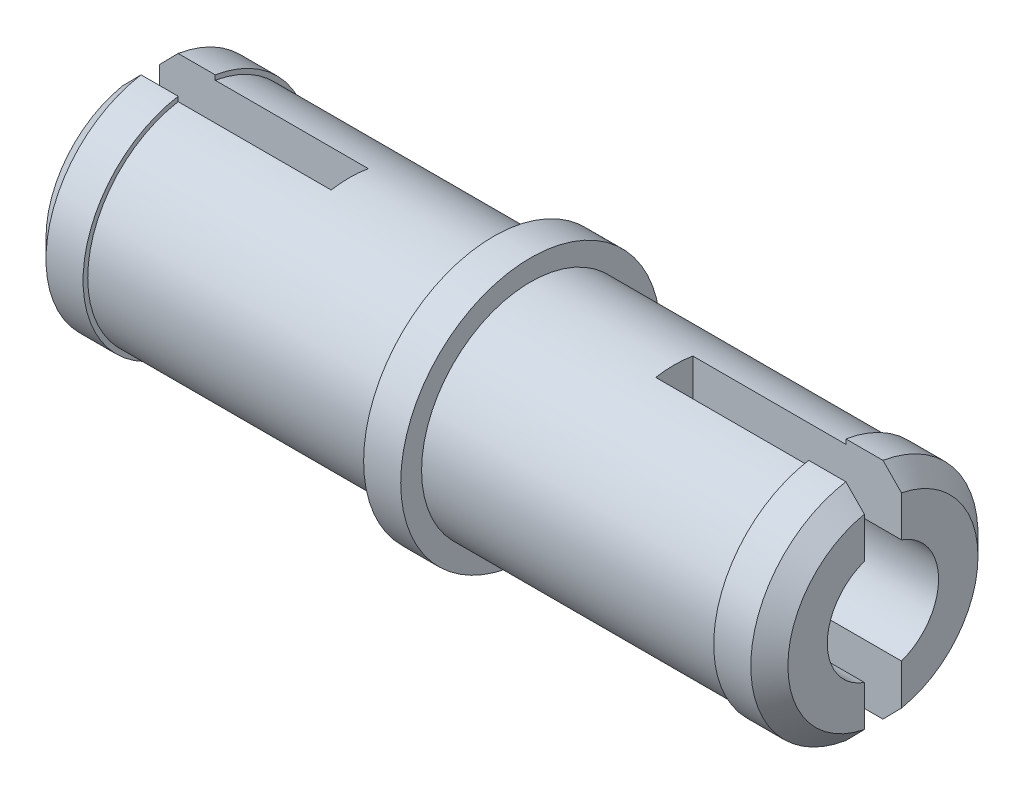
ISO-10303-21;
HEADER;
FILE_DESCRIPTION(('STEP AP214'),'2;1');
FILE_NAME('part.step','',(''),(''),'','','');
FILE_SCHEMA(('AUTOMOTIVE_DESIGN { 1 0 10303 214 1 1 1 1 }'));
ENDSEC;
DATA;
#1=APPLICATION_CONTEXT('core data for automotive mechanical design processes');
#2=APPLICATION_PROTOCOL_DEFINITION('international standard','automotive_design',2000,#1);
#3=PRODUCT_CONTEXT('',#1,'mechanical');
#4=PRODUCT('Part','Part','',(#3));
#5=PRODUCT_RELATED_PRODUCT_CATEGORY('part','',(#4));
#6=PRODUCT_DEFINITION_FORMATION('','',#4);
#7=PRODUCT_DEFINITION_CONTEXT('part definition',#1,'design');
#8=PRODUCT_DEFINITION('design','',#6,#7);
#9=PRODUCT_DEFINITION_SHAPE('','',#8);
#10=(LENGTH_UNIT() NAMED_UNIT(*) SI_UNIT(.MILLI.,.METRE.));
#11=(NAMED_UNIT(*) PLANE_ANGLE_UNIT() SI_UNIT($,.RADIAN.));
#12=(NAMED_UNIT(*) SI_UNIT($,.STERADIAN.) SOLID_ANGLE_UNIT());
#13=UNCERTAINTY_MEASURE_WITH_UNIT(LENGTH_MEASURE(1.E-05),#10,'distance_accuracy_value','');
#14=(GEOMETRIC_REPRESENTATION_CONTEXT(3) GLOBAL_UNCERTAINTY_ASSIGNED_CONTEXT((#13)) GLOBAL_UNIT_ASSIGNED_CONTEXT((#10,
#11,#12)) REPRESENTATION_CONTEXT('',''));
#15=CARTESIAN_POINT('',(0.,0.,0.));
#16=DIRECTION('',(0.,0.,1.));
#17=DIRECTION('',(1.,0.,0.));
#18=AXIS2_PLACEMENT_3D('',#15,#16,#17);
#19=CARTESIAN_POINT('',(3.5,-2.8,-0.400000000000001));
#20=DIRECTION('',(-1.,0.,0.));
#21=DIRECTION('',(0.,0.,1.));
#22=AXIS2_PLACEMENT_3D('',#19,#20,#21);
#23=PLANE('',#22);
#24=DIRECTION('',(0.,1.,0.));
#25=VECTOR('',#24,1.);
#26=CARTESIAN_POINT('',(3.5,-2.8,0.399999999999999));
#27=LINE('',#26,#25);
#28=CARTESIAN_POINT('',(3.5,1.13137084989848,0.399999999999999));
#29=VERTEX_POINT('',#28);
#30=CARTESIAN_POINT('',(3.5,2.31570723538188,0.399999999999999));
#31=VERTEX_POINT('',#30);
#32=EDGE_CURVE('E445',#29,#31,#27,.T.);
#33=ORIENTED_EDGE('',*,*,#32,.F.);
#34=CARTESIAN_POINT('',(3.5,0.,0.));
#35=DIRECTION('',(-1.,0.,0.));
#36=DIRECTION('',(0.,0.,1.));
#37=AXIS2_PLACEMENT_3D('',#34,#35,#36);
#38=CIRCLE('',#37,1.2);
#39=CARTESIAN_POINT('',(3.5,1.13137084989848,-0.400000000000001));
#40=VERTEX_POINT('',#39);
#41=EDGE_CURVE('E60',#29,#40,#38,.T.);
#42=ORIENTED_EDGE('',*,*,#41,.T.);
#43=DIRECTION('',(0.,1.,0.));
#44=VECTOR('',#43,1.);
#45=CARTESIAN_POINT('',(3.5,-2.8,-0.400000000000001));
#46=LINE('',#45,#44);
#47=CARTESIAN_POINT('',(3.5,2.31570723538188,-0.400000000000001));
#48=VERTEX_POINT('',#47);
#49=EDGE_CURVE('E436',#40,#48,#46,.T.);
#50=ORIENTED_EDGE('',*,*,#49,.T.);
#51=CARTESIAN_POINT('',(3.5,0.,0.));
#52=DIRECTION('',(-1.,0.,0.));
#53=DIRECTION('',(0.,0.,1.));
#54=AXIS2_PLACEMENT_3D('',#51,#52,#53);
#55=CIRCLE('',#54,2.35);
#56=EDGE_CURVE('E312',#31,#48,#55,.T.);
#57=ORIENTED_EDGE('',*,*,#56,.F.);
#58=EDGE_LOOP('',(#33,#42,#50,#57));
#59=FACE_BOUND('',#58,.T.);
#60=ADVANCED_FACE('F43',(#59),#23,.F.);
#61=CARTESIAN_POINT('',(9.51719509390282,-2.8,-0.400000000000001));
#62=DIRECTION('',(0.,0.,-1.));
#63=DIRECTION('',(-1.,0.,0.));
#64=AXIS2_PLACEMENT_3D('',#61,#62,#63);
#65=PLANE('',#64);
#66=ORIENTED_EDGE('',*,*,#49,.F.);
#67=DIRECTION('',(1.,0.,0.));
#68=VECTOR('',#67,1.);
#69=CARTESIAN_POINT('',(-8.,1.13137084989848,-0.4));
#70=LINE('',#69,#68);
#71=CARTESIAN_POINT('',(8.,1.13137084989848,-0.4));
#72=VERTEX_POINT('',#71);
#73=EDGE_CURVE('E427',#40,#72,#70,.T.);
#74=ORIENTED_EDGE('',*,*,#73,.T.);
#75=DIRECTION('',(0.,-1.,0.));
#76=VECTOR('',#75,1.);
#77=CARTESIAN_POINT('',(8.,2.45,-0.400000000000001));
#78=LINE('',#77,#76);
#79=CARTESIAN_POINT('',(8.,2.01059692628831,-0.400000000000001));
#80=VERTEX_POINT('',#79);
#81=EDGE_CURVE('E470',#80,#72,#78,.T.);
#82=ORIENTED_EDGE('',*,*,#81,.F.);
#83=CARTESIAN_POINT('',(8.,2.01059692628831,-0.400000000000001));
#84=CARTESIAN_POINT('',(7.93343243156125,2.07844935031966,-0.400000000000001));
#85=CARTESIAN_POINT('',(7.86681531242129,2.14625301950762,-0.400000000000001));
#86=CARTESIAN_POINT('',(7.73348197907854,2.2817628417537,-0.400000000000001));
#87=CARTESIAN_POINT('',(7.66676576488516,2.34946899482109,-0.400000000000001));
#88=CARTESIAN_POINT('',(7.6,2.41712639305437,-0.400000000000001));
#89=B_SPLINE_CURVE_WITH_KNOTS('',3,(#83,#84,#85,#86,#87,#88),.UNSPECIFIED.,.F.,.F.,(4,2,4),(0.,
0.285160661839464,0.57032129656195),.UNSPECIFIED.);
#90=CARTESIAN_POINT('',(7.6,2.41712639305437,-0.4));
#91=VERTEX_POINT('',#90);
#92=EDGE_CURVE('E519',#80,#91,#89,.T.);
#93=ORIENTED_EDGE('',*,*,#92,.T.);
#94=DIRECTION('',(-1.,0.,0.));
#95=VECTOR('',#94,1.);
#96=CARTESIAN_POINT('',(-8.,2.41712639305437,-0.4));
#97=LINE('',#96,#95);
#98=CARTESIAN_POINT('',(6.8,2.41712639305437,-0.4));
#99=VERTEX_POINT('',#98);
#100=EDGE_CURVE('E304',#99,#91,#97,.F.);
#101=ORIENTED_EDGE('',*,*,#100,.F.);
#102=DIRECTION('',(0.,1.,0.));
#103=VECTOR('',#102,1.);
#104=CARTESIAN_POINT('',(6.8,2.35,-0.400000000000001));
#105=LINE('',#104,#103);
#106=CARTESIAN_POINT('',(6.8,2.31570723538188,-0.400000000000001));
#107=VERTEX_POINT('',#106);
#108=EDGE_CURVE('E462',#107,#99,#105,.T.);
#109=ORIENTED_EDGE('',*,*,#108,.F.);
#110=DIRECTION('',(-1.,0.,0.));
#111=VECTOR('',#110,1.);
#112=CARTESIAN_POINT('',(-8.,2.31570723538188,-0.4));
#113=LINE('',#112,#111);
#114=EDGE_CURVE('E465',#48,#107,#113,.F.);
#115=ORIENTED_EDGE('',*,*,#114,.F.);
#116=EDGE_LOOP('',(#66,#74,#82,#93,#101,#109,#115));
#117=FACE_BOUND('',#116,.T.);
#118=ADVANCED_FACE('F563',(#117),#65,.F.);
#119=CARTESIAN_POINT('',(9.51719509390282,-2.8,0.399999999999999));
#120=DIRECTION('',(0.,0.,1.));
#121=DIRECTION('',(1.,0.,0.));
#122=AXIS2_PLACEMENT_3D('',#119,#120,#121);
#123=PLANE('',#122);
#124=CARTESIAN_POINT('',(3.5,-2.31570723538188,0.399999999999999));
#125=VERTEX_POINT('',#124);
#126=CARTESIAN_POINT('',(3.5,-1.13137084989848,0.4));
#127=VERTEX_POINT('',#126);
#128=EDGE_CURVE('E442',#125,#127,#27,.T.);
#129=ORIENTED_EDGE('',*,*,#128,.T.);
#130=DIRECTION('',(1.,0.,0.));
#131=VECTOR('',#130,1.);
#132=CARTESIAN_POINT('',(-8.,-1.13137084989848,0.4));
#133=LINE('',#132,#131);
#134=CARTESIAN_POINT('',(8.,-1.13137084989848,0.399999999999999));
#135=VERTEX_POINT('',#134);
#136=EDGE_CURVE('E424',#127,#135,#133,.T.);
#137=ORIENTED_EDGE('',*,*,#136,.T.);
#138=DIRECTION('',(0.,1.,0.));
#139=VECTOR('',#138,1.);
#140=CARTESIAN_POINT('',(8.,2.45,0.399999999999999));
#141=LINE('',#140,#139);
#142=CARTESIAN_POINT('',(8.,-2.01059692628831,0.399999999999999));
#143=VERTEX_POINT('',#142);
#144=EDGE_CURVE('E456',#143,#135,#141,.T.);
#145=ORIENTED_EDGE('',*,*,#144,.F.);
#146=CARTESIAN_POINT('',(8.,-2.01059692628831,0.399999999999999));
#147=CARTESIAN_POINT('',(7.93343243156125,-2.07844935031966,0.399999999999999));
#148=CARTESIAN_POINT('',(7.86681531242129,-2.14625301950762,0.399999999999999));
#149=CARTESIAN_POINT('',(7.73348197907854,-2.2817628417537,0.399999999999999));
#150=CARTESIAN_POINT('',(7.66676576488516,-2.34946899482109,0.399999999999999));
#151=CARTESIAN_POINT('',(7.6,-2.41712639305437,0.399999999999999));
#152=B_SPLINE_CURVE_WITH_KNOTS('',3,(#146,#147,#148,#149,#150,#151),.UNSPECIFIED.,.F.,.F.,(4,2,
4),(0.,0.285160661839464,0.57032129656195),.UNSPECIFIED.);
#153=CARTESIAN_POINT('',(7.6,-2.41712639305437,0.4));
#154=VERTEX_POINT('',#153);
#155=EDGE_CURVE('E380',#143,#154,#152,.T.);
#156=ORIENTED_EDGE('',*,*,#155,.T.);
#157=DIRECTION('',(-1.,0.,0.));
#158=VECTOR('',#157,1.);
#159=CARTESIAN_POINT('',(-8.,-2.41712639305437,0.4));
#160=LINE('',#159,#158);
#161=CARTESIAN_POINT('',(6.8,-2.41712639305437,0.4));
#162=VERTEX_POINT('',#161);
#163=EDGE_CURVE('E299',#162,#154,#160,.F.);
#164=ORIENTED_EDGE('',*,*,#163,.F.);
#165=DIRECTION('',(0.,-1.,0.));
#166=VECTOR('',#165,1.);
#167=CARTESIAN_POINT('',(6.8,2.35,0.399999999999999));
#168=LINE('',#167,#166);
#169=CARTESIAN_POINT('',(6.8,-2.31570723538188,0.399999999999999));
#170=VERTEX_POINT('',#169);
#171=EDGE_CURVE('E438',#170,#162,#168,.T.);
#172=ORIENTED_EDGE('',*,*,#171,.F.);
#173=DIRECTION('',(-1.,0.,0.));
#174=VECTOR('',#173,1.);
#175=CARTESIAN_POINT('',(-8.,-2.31570723538188,0.4));
#176=LINE('',#175,#174);
#177=EDGE_CURVE('E451',#125,#170,#176,.F.);
#178=ORIENTED_EDGE('',*,*,#177,.F.);
#179=EDGE_LOOP('',(#129,#137,#145,#156,#164,#172,#178));
#180=FACE_BOUND('',#179,.T.);
#181=ADVANCED_FACE('F375',(#180),#123,.F.);
#182=CARTESIAN_POINT('',(-3.5,-2.8,-0.4));
#183=DIRECTION('',(1.,0.,0.));
#184=DIRECTION('',(0.,0.,-1.));
#185=AXIS2_PLACEMENT_3D('',#182,#183,#184);
#186=PLANE('',#185);
#187=DIRECTION('',(0.,1.,0.));
#188=VECTOR('',#187,1.);
#189=CARTESIAN_POINT('',(-3.5,-2.8,-0.4));
#190=LINE('',#189,#188);
#191=CARTESIAN_POINT('',(-3.5,1.13137084989848,-0.4));
#192=VERTEX_POINT('',#191);
#193=CARTESIAN_POINT('',(-3.5,2.31570723538188,-0.4));
#194=VERTEX_POINT('',#193);
#195=EDGE_CURVE('E441',#192,#194,#190,.T.);
#196=ORIENTED_EDGE('',*,*,#195,.F.);
#197=CARTESIAN_POINT('',(-3.5,0.,0.));
#198=DIRECTION('',(1.,0.,0.));
#199=DIRECTION('',(0.,0.,-1.));
#200=AXIS2_PLACEMENT_3D('',#197,#198,#199);
#201=CIRCLE('',#200,1.2);
#202=CARTESIAN_POINT('',(-3.5,1.13137084989848,0.4));
#203=VERTEX_POINT('',#202);
#204=EDGE_CURVE('E229',#192,#203,#201,.T.);
#205=ORIENTED_EDGE('',*,*,#204,.T.);
#206=DIRECTION('',(0.,1.,0.));
#207=VECTOR('',#206,1.);
#208=CARTESIAN_POINT('',(-3.5,-2.8,0.4));
#209=LINE('',#208,#207);
#210=CARTESIAN_POINT('',(-3.5,2.31570723538188,0.4));
#211=VERTEX_POINT('',#210);
#212=EDGE_CURVE('E439',#203,#211,#209,.T.);
#213=ORIENTED_EDGE('',*,*,#212,.T.);
#214=CARTESIAN_POINT('',(-3.5,0.,0.));
#215=DIRECTION('',(1.,0.,0.));
#216=DIRECTION('',(0.,0.,-1.));
#217=AXIS2_PLACEMENT_3D('',#214,#215,#216);
#218=CIRCLE('',#217,2.35);
#219=EDGE_CURVE('E316',#194,#211,#218,.T.);
#220=ORIENTED_EDGE('',*,*,#219,.F.);
#221=EDGE_LOOP('',(#196,#205,#213,#220));
#222=FACE_BOUND('',#221,.T.);
#223=ADVANCED_FACE('F364',(#222),#186,.F.);
#224=CARTESIAN_POINT('',(-10.410571644863,-2.8,0.4));
#225=DIRECTION('',(0.,0.,1.));
#226=DIRECTION('',(1.,0.,0.));
#227=AXIS2_PLACEMENT_3D('',#224,#225,#226);
#228=PLANE('',#227);
#229=DIRECTION('',(0.,-1.,0.));
#230=VECTOR('',#229,1.);
#231=CARTESIAN_POINT('',(-8.,0.,0.4));
#232=LINE('',#231,#230);
#233=CARTESIAN_POINT('',(-8.,-1.13137084989848,0.4));
#234=VERTEX_POINT('',#233);
#235=CARTESIAN_POINT('',(-8.,-2.01059692628831,0.4));
#236=VERTEX_POINT('',#235);
#237=EDGE_CURVE('E264',#234,#236,#232,.T.);
#238=ORIENTED_EDGE('',*,*,#237,.F.);
#239=DIRECTION('',(1.,0.,0.));
#240=VECTOR('',#239,1.);
#241=CARTESIAN_POINT('',(-8.,-1.13137084989848,0.4));
#242=LINE('',#241,#240);
#243=CARTESIAN_POINT('',(-3.5,-1.13137084989848,0.4));
#244=VERTEX_POINT('',#243);
#245=EDGE_CURVE('E405',#234,#244,#242,.T.);
#246=ORIENTED_EDGE('',*,*,#245,.T.);
#247=CARTESIAN_POINT('',(-3.5,-2.31570723538188,0.4));
#248=VERTEX_POINT('',#247);
#249=EDGE_CURVE('E404',#248,#244,#209,.T.);
#250=ORIENTED_EDGE('',*,*,#249,.F.);
#251=DIRECTION('',(-1.,0.,0.));
#252=VECTOR('',#251,1.);
#253=CARTESIAN_POINT('',(-8.,-2.31570723538188,0.4));
#254=LINE('',#253,#252);
#255=CARTESIAN_POINT('',(-6.8,-2.31570723538188,0.4));
#256=VERTEX_POINT('',#255);
#257=EDGE_CURVE('E326',#256,#248,#254,.F.);
#258=ORIENTED_EDGE('',*,*,#257,.F.);
#259=DIRECTION('',(0.,1.,0.));
#260=VECTOR('',#259,1.);
#261=CARTESIAN_POINT('',(-6.8,2.45,0.4));
#262=LINE('',#261,#260);
#263=CARTESIAN_POINT('',(-6.8,-2.41712639305437,0.4));
#264=VERTEX_POINT('',#263);
#265=EDGE_CURVE('E258',#264,#256,#262,.T.);
#266=ORIENTED_EDGE('',*,*,#265,.F.);
#267=DIRECTION('',(-1.,0.,0.));
#268=VECTOR('',#267,1.);
#269=CARTESIAN_POINT('',(-8.,-2.41712639305437,0.4));
#270=LINE('',#269,#268);
#271=CARTESIAN_POINT('',(-7.6,-2.41712639305437,0.4));
#272=VERTEX_POINT('',#271);
#273=EDGE_CURVE('E261',#272,#264,#270,.F.);
#274=ORIENTED_EDGE('',*,*,#273,.F.);
#275=CARTESIAN_POINT('',(-7.6,-2.41712639305437,0.4));
#276=CARTESIAN_POINT('',(-7.66676576488516,-2.34946899482109,0.4));
#277=CARTESIAN_POINT('',(-7.73348197907853,-2.2817628417537,0.4));
#278=CARTESIAN_POINT('',(-7.86681531242129,-2.14625301950762,0.4));
#279=CARTESIAN_POINT('',(-7.93343243156125,-2.07844935031966,0.4));
#280=CARTESIAN_POINT('',(-8.,-2.01059692628831,0.4));
#281=B_SPLINE_CURVE_WITH_KNOTS('',3,(#275,#276,#277,#278,#279,#280),.UNSPECIFIED.,.F.,.F.,(4,2,
4),(0.,0.285160634722486,0.570321296561949),.UNSPECIFIED.);
#282=EDGE_CURVE('E508',#272,#236,#281,.T.);
#283=ORIENTED_EDGE('',*,*,#282,.T.);
#284=EDGE_LOOP('',(#238,#246,#250,#258,#266,#274,#283));
#285=FACE_BOUND('',#284,.T.);
#286=ADVANCED_FACE('F495',(#285),#228,.F.);
#287=CARTESIAN_POINT('',(-10.410571644863,-2.8,-0.4));
#288=DIRECTION('',(0.,0.,-1.));
#289=DIRECTION('',(-1.,0.,0.));
#290=AXIS2_PLACEMENT_3D('',#287,#288,#289);
#291=PLANE('',#290);
#292=DIRECTION('',(0.,1.,0.));
#293=VECTOR('',#292,1.);
#294=CARTESIAN_POINT('',(-8.,0.,-0.4));
#295=LINE('',#294,#293);
#296=CARTESIAN_POINT('',(-8.,1.13137084989848,-0.4));
#297=VERTEX_POINT('',#296);
#298=CARTESIAN_POINT('',(-8.,2.01059692628831,-0.4));
#299=VERTEX_POINT('',#298);
#300=EDGE_CURVE('E237',#297,#299,#295,.T.);
#301=ORIENTED_EDGE('',*,*,#300,.F.);
#302=DIRECTION('',(1.,0.,0.));
#303=VECTOR('',#302,1.);
#304=CARTESIAN_POINT('',(-8.,1.13137084989848,-0.4));
#305=LINE('',#304,#303);
#306=EDGE_CURVE('E11',#297,#192,#305,.T.);
#307=ORIENTED_EDGE('',*,*,#306,.T.);
#308=ORIENTED_EDGE('',*,*,#195,.T.);
#309=DIRECTION('',(-1.,0.,0.));
#310=VECTOR('',#309,1.);
#311=CARTESIAN_POINT('',(-8.,2.31570723538188,-0.4));
#312=LINE('',#311,#310);
#313=CARTESIAN_POINT('',(-6.8,2.31570723538188,-0.4));
#314=VERTEX_POINT('',#313);
#315=EDGE_CURVE('E313',#314,#194,#312,.F.);
#316=ORIENTED_EDGE('',*,*,#315,.F.);
#317=DIRECTION('',(0.,-1.,0.));
#318=VECTOR('',#317,1.);
#319=CARTESIAN_POINT('',(-6.8,2.45,-0.4));
#320=LINE('',#319,#318);
#321=CARTESIAN_POINT('',(-6.8,2.41712639305436,-0.4));
#322=VERTEX_POINT('',#321);
#323=EDGE_CURVE('E251',#322,#314,#320,.T.);
#324=ORIENTED_EDGE('',*,*,#323,.F.);
#325=DIRECTION('',(-1.,0.,0.));
#326=VECTOR('',#325,1.);
#327=CARTESIAN_POINT('',(-8.,2.41712639305436,-0.4));
#328=LINE('',#327,#326);
#329=CARTESIAN_POINT('',(-7.6,2.41712639305436,-0.4));
#330=VERTEX_POINT('',#329);
#331=EDGE_CURVE('E248',#330,#322,#328,.F.);
#332=ORIENTED_EDGE('',*,*,#331,.F.);
#333=CARTESIAN_POINT('',(-7.6,2.41712639305436,-0.4));
#334=CARTESIAN_POINT('',(-7.66676576488516,2.34946899482109,-0.4));
#335=CARTESIAN_POINT('',(-7.73348197907853,2.2817628417537,-0.4));
#336=CARTESIAN_POINT('',(-7.86681531242129,2.14625301950762,-0.4));
#337=CARTESIAN_POINT('',(-7.93343243156125,2.07844935031966,-0.4));
#338=CARTESIAN_POINT('',(-8.,2.01059692628831,-0.4));
#339=B_SPLINE_CURVE_WITH_KNOTS('',3,(#333,#334,#335,#336,#337,#338),.UNSPECIFIED.,.F.,.F.,(4,2,
4),(0.,0.285160634722486,0.570321296561949),.UNSPECIFIED.);
#340=EDGE_CURVE('E246',#330,#299,#339,.T.);
#341=ORIENTED_EDGE('',*,*,#340,.T.);
#342=EDGE_LOOP('',(#301,#307,#308,#316,#324,#332,#341));
#343=FACE_BOUND('',#342,.T.);
#344=ADVANCED_FACE('F243',(#343),#291,.F.);
#345=CARTESIAN_POINT('',(8.,2.45,0.));
#346=DIRECTION('',(-1.,0.,0.));
#347=DIRECTION('',(0.,0.,1.));
#348=AXIS2_PLACEMENT_3D('',#345,#346,#347);
#349=PLANE('',#348);
#350=ORIENTED_EDGE('',*,*,#81,.T.);
#351=CARTESIAN_POINT('',(8.,0.,0.));
#352=DIRECTION('',(-1.,0.,0.));
#353=DIRECTION('',(0.,0.,1.));
#354=AXIS2_PLACEMENT_3D('',#351,#352,#353);
#355=CIRCLE('',#354,1.2);
#356=CARTESIAN_POINT('',(8.,-1.13137084989848,-0.400000000000001));
#357=VERTEX_POINT('',#356);
#358=EDGE_CURVE('E430',#72,#357,#355,.T.);
#359=ORIENTED_EDGE('',*,*,#358,.T.);
#360=CARTESIAN_POINT('',(8.,-2.01059692628831,-0.400000000000001));
#361=VERTEX_POINT('',#360);
#362=EDGE_CURVE('E469',#357,#361,#78,.T.);
#363=ORIENTED_EDGE('',*,*,#362,.T.);
#364=CARTESIAN_POINT('',(8.,0.,0.));
#365=DIRECTION('',(-1.,0.,0.));
#366=DIRECTION('',(0.,0.,1.));
#367=AXIS2_PLACEMENT_3D('',#364,#365,#366);
#368=CIRCLE('',#367,2.05);
#369=EDGE_CURVE('E587',#361,#80,#368,.F.);
#370=ORIENTED_EDGE('',*,*,#369,.T.);
#371=EDGE_LOOP('',(#350,#359,#363,#370));
#372=FACE_BOUND('',#371,.T.);
#373=ADVANCED_FACE('F619',(#372),#349,.F.);
#374=CARTESIAN_POINT('',(-8.,0.,0.));
#375=DIRECTION('',(1.,0.,0.));
#376=DIRECTION('',(0.,0.,-1.));
#377=AXIS2_PLACEMENT_3D('',#374,#375,#376);
#378=PLANE('',#377);
#379=CARTESIAN_POINT('',(-8.,2.01059692628831,0.4));
#380=VERTEX_POINT('',#379);
#381=CARTESIAN_POINT('',(-8.,1.13137084989848,0.4));
#382=VERTEX_POINT('',#381);
#383=EDGE_CURVE('E265',#380,#382,#232,.T.);
#384=ORIENTED_EDGE('',*,*,#383,.T.);
#385=CARTESIAN_POINT('',(-8.,0.,0.));
#386=DIRECTION('',(1.,0.,0.));
#387=DIRECTION('',(0.,0.,-1.));
#388=AXIS2_PLACEMENT_3D('',#385,#386,#387);
#389=CIRCLE('',#388,1.2);
#390=EDGE_CURVE('E241',#382,#234,#389,.T.);
#391=ORIENTED_EDGE('',*,*,#390,.T.);
#392=ORIENTED_EDGE('',*,*,#237,.T.);
#393=CARTESIAN_POINT('',(-8.,0.,0.));
#394=DIRECTION('',(1.,0.,0.));
#395=DIRECTION('',(0.,0.,-1.));
#396=AXIS2_PLACEMENT_3D('',#393,#394,#395);
#397=CIRCLE('',#396,2.05);
#398=EDGE_CURVE('E502',#236,#380,#397,.F.);
#399=ORIENTED_EDGE('',*,*,#398,.T.);
#400=EDGE_LOOP('',(#384,#391,#392,#399));
#401=FACE_BOUND('',#400,.T.);
#402=ADVANCED_FACE('F499',(#401),#378,.F.);
#403=CARTESIAN_POINT('',(-8.,0.,0.));
#404=DIRECTION('',(-1.,0.,0.));
#405=DIRECTION('',(0.,0.,1.));
#406=AXIS2_PLACEMENT_3D('',#403,#404,#405);
#407=CYLINDRICAL_SURFACE('',#406,2.45);
#408=DIRECTION('',(-1.,0.,0.));
#409=VECTOR('',#408,1.);
#410=CARTESIAN_POINT('',(-8.,2.41712639305436,0.4));
#411=LINE('',#410,#409);
#412=CARTESIAN_POINT('',(-6.8,2.41712639305436,0.4));
#413=VERTEX_POINT('',#412);
#414=CARTESIAN_POINT('',(-7.6,2.41712639305436,0.4));
#415=VERTEX_POINT('',#414);
#416=EDGE_CURVE('E268',#413,#415,#411,.T.);
#417=ORIENTED_EDGE('',*,*,#416,.T.);
#418=CARTESIAN_POINT('',(-7.6,0.,0.));
#419=DIRECTION('',(1.,0.,0.));
#420=DIRECTION('',(0.,0.,-1.));
#421=AXIS2_PLACEMENT_3D('',#418,#419,#420);
#422=CIRCLE('',#421,2.45);
#423=EDGE_CURVE('E507',#415,#272,#422,.T.);
#424=ORIENTED_EDGE('',*,*,#423,.T.);
#425=ORIENTED_EDGE('',*,*,#273,.T.);
#426=CARTESIAN_POINT('',(-6.8,0.,0.));
#427=DIRECTION('',(-1.,0.,0.));
#428=DIRECTION('',(0.,0.,1.));
#429=AXIS2_PLACEMENT_3D('',#426,#427,#428);
#430=CIRCLE('',#429,2.45);
#431=EDGE_CURVE('E295',#264,#413,#430,.T.);
#432=ORIENTED_EDGE('',*,*,#431,.T.);
#433=EDGE_LOOP('',(#417,#424,#425,#432));
#434=FACE_BOUND('',#433,.T.);
#435=ADVANCED_FACE('F511',(#434),#407,.T.);
#436=CARTESIAN_POINT('',(-6.8,2.45,0.));
#437=DIRECTION('',(-1.,0.,0.));
#438=DIRECTION('',(0.,0.,1.));
#439=AXIS2_PLACEMENT_3D('',#436,#437,#438);
#440=PLANE('',#439);
#441=ORIENTED_EDGE('',*,*,#431,.F.);
#442=ORIENTED_EDGE('',*,*,#265,.T.);
#443=CARTESIAN_POINT('',(-6.8,0.,0.));
#444=DIRECTION('',(-1.,0.,0.));
#445=DIRECTION('',(0.,0.,1.));
#446=AXIS2_PLACEMENT_3D('',#443,#444,#445);
#447=CIRCLE('',#446,2.35);
#448=CARTESIAN_POINT('',(-6.8,2.31570723538188,0.4));
#449=VERTEX_POINT('',#448);
#450=EDGE_CURVE('E291',#256,#449,#447,.T.);
#451=ORIENTED_EDGE('',*,*,#450,.T.);
#452=EDGE_CURVE('E262',#449,#413,#262,.T.);
#453=ORIENTED_EDGE('',*,*,#452,.T.);
#454=EDGE_LOOP('',(#441,#442,#451,#453));
#455=FACE_BOUND('',#454,.T.);
#456=ADVANCED_FACE('F636',(#455),#440,.F.);
#457=CARTESIAN_POINT('',(6.8,2.35,0.));
#458=DIRECTION('',(1.,0.,0.));
#459=DIRECTION('',(0.,0.,-1.));
#460=AXIS2_PLACEMENT_3D('',#457,#458,#459);
#461=PLANE('',#460);
#462=CARTESIAN_POINT('',(6.8,0.,0.));
#463=DIRECTION('',(-1.,0.,0.));
#464=DIRECTION('',(0.,0.,1.));
#465=AXIS2_PLACEMENT_3D('',#462,#463,#464);
#466=CIRCLE('',#465,2.45);
#467=CARTESIAN_POINT('',(6.8,-2.41712639305437,-0.4));
#468=VERTEX_POINT('',#467);
#469=EDGE_CURVE('E274',#99,#468,#466,.T.);
#470=ORIENTED_EDGE('',*,*,#469,.T.);
#471=CARTESIAN_POINT('',(6.8,-2.31570723538188,-0.400000000000001));
#472=VERTEX_POINT('',#471);
#473=EDGE_CURVE('E466',#468,#472,#105,.T.);
#474=ORIENTED_EDGE('',*,*,#473,.T.);
#475=CARTESIAN_POINT('',(6.8,0.,0.));
#476=DIRECTION('',(-1.,0.,0.));
#477=DIRECTION('',(0.,0.,1.));
#478=AXIS2_PLACEMENT_3D('',#475,#476,#477);
#479=CIRCLE('',#478,2.35);
#480=EDGE_CURVE('E278',#107,#472,#479,.T.);
#481=ORIENTED_EDGE('',*,*,#480,.F.);
#482=ORIENTED_EDGE('',*,*,#108,.T.);
#483=EDGE_LOOP('',(#470,#474,#481,#482));
#484=FACE_BOUND('',#483,.T.);
#485=ADVANCED_FACE('F606',(#484),#461,.F.);
#486=CARTESIAN_POINT('',(-8.,0.,0.));
#487=DIRECTION('',(-1.,0.,0.));
#488=DIRECTION('',(0.,0.,1.));
#489=AXIS2_PLACEMENT_3D('',#486,#487,#488);
#490=CYLINDRICAL_SURFACE('',#489,2.45);
#491=ORIENTED_EDGE('',*,*,#100,.T.);
#492=CARTESIAN_POINT('',(7.6,0.,0.));
#493=DIRECTION('',(-1.,0.,0.));
#494=DIRECTION('',(0.,0.,1.));
#495=AXIS2_PLACEMENT_3D('',#492,#493,#494);
#496=CIRCLE('',#495,2.45);
#497=CARTESIAN_POINT('',(7.6,-2.41712639305437,-0.4));
#498=VERTEX_POINT('',#497);
#499=EDGE_CURVE('E516',#91,#498,#496,.T.);
#500=ORIENTED_EDGE('',*,*,#499,.T.);
#501=DIRECTION('',(-1.,0.,0.));
#502=VECTOR('',#501,1.);
#503=CARTESIAN_POINT('',(-8.,-2.41712639305437,-0.4));
#504=LINE('',#503,#502);
#505=EDGE_CURVE('E307',#498,#468,#504,.T.);
#506=ORIENTED_EDGE('',*,*,#505,.T.);
#507=ORIENTED_EDGE('',*,*,#469,.F.);
#508=EDGE_LOOP('',(#491,#500,#506,#507));
#509=FACE_BOUND('',#508,.T.);
#510=ADVANCED_FACE('F602',(#509),#490,.T.);
#511=ORIENTED_EDGE('',*,*,#144,.T.);
#512=CARTESIAN_POINT('',(8.,0.,0.));
#513=DIRECTION('',(-1.,0.,0.));
#514=DIRECTION('',(0.,0.,1.));
#515=AXIS2_PLACEMENT_3D('',#512,#513,#514);
#516=CIRCLE('',#515,1.2);
#517=CARTESIAN_POINT('',(8.,1.13137084989848,0.4));
#518=VERTEX_POINT('',#517);
#519=EDGE_CURVE('E420',#135,#518,#516,.T.);
#520=ORIENTED_EDGE('',*,*,#519,.T.);
#521=CARTESIAN_POINT('',(8.,2.01059692628831,0.399999999999999));
#522=VERTEX_POINT('',#521);
#523=EDGE_CURVE('E455',#518,#522,#141,.T.);
#524=ORIENTED_EDGE('',*,*,#523,.T.);
#525=CARTESIAN_POINT('',(8.,0.,0.));
#526=DIRECTION('',(-1.,0.,0.));
#527=DIRECTION('',(0.,0.,1.));
#528=AXIS2_PLACEMENT_3D('',#525,#526,#527);
#529=CIRCLE('',#528,2.05);
#530=EDGE_CURVE('E394',#522,#143,#529,.F.);
#531=ORIENTED_EDGE('',*,*,#530,.T.);
#532=EDGE_LOOP('',(#511,#520,#524,#531));
#533=FACE_BOUND('',#532,.T.);
#534=ADVANCED_FACE('F578',(#533),#349,.F.);
#535=CARTESIAN_POINT('',(-8.,-2.01059692628831,-0.4));
#536=VERTEX_POINT('',#535);
#537=CARTESIAN_POINT('',(-8.,-1.13137084989848,-0.4));
#538=VERTEX_POINT('',#537);
#539=EDGE_CURVE('E240',#536,#538,#295,.T.);
#540=ORIENTED_EDGE('',*,*,#539,.T.);
#541=EDGE_CURVE('E68',#538,#297,#389,.T.);
#542=ORIENTED_EDGE('',*,*,#541,.T.);
#543=ORIENTED_EDGE('',*,*,#300,.T.);
#544=CARTESIAN_POINT('',(-8.,0.,0.));
#545=DIRECTION('',(1.,0.,0.));
#546=DIRECTION('',(0.,0.,-1.));
#547=AXIS2_PLACEMENT_3D('',#544,#545,#546);
#548=CIRCLE('',#547,2.05);
#549=EDGE_CURVE('E329',#299,#536,#548,.F.);
#550=ORIENTED_EDGE('',*,*,#549,.T.);
#551=EDGE_LOOP('',(#540,#542,#543,#550));
#552=FACE_BOUND('',#551,.T.);
#553=ADVANCED_FACE('F235',(#552),#378,.F.);
#554=DIRECTION('',(-1.,0.,0.));
#555=VECTOR('',#554,1.);
#556=CARTESIAN_POINT('',(-8.,-2.41712639305437,-0.4));
#557=LINE('',#556,#555);
#558=CARTESIAN_POINT('',(-6.8,-2.41712639305437,-0.4));
#559=VERTEX_POINT('',#558);
#560=CARTESIAN_POINT('',(-7.6,-2.41712639305437,-0.4));
#561=VERTEX_POINT('',#560);
#562=EDGE_CURVE('E250',#559,#561,#557,.T.);
#563=ORIENTED_EDGE('',*,*,#562,.T.);
#564=CARTESIAN_POINT('',(-7.6,0.,0.));
#565=DIRECTION('',(1.,0.,0.));
#566=DIRECTION('',(0.,0.,-1.));
#567=AXIS2_PLACEMENT_3D('',#564,#565,#566);
#568=CIRCLE('',#567,2.45);
#569=EDGE_CURVE('E487',#561,#330,#568,.T.);
#570=ORIENTED_EDGE('',*,*,#569,.T.);
#571=ORIENTED_EDGE('',*,*,#331,.T.);
#572=EDGE_CURVE('E298',#322,#559,#430,.T.);
#573=ORIENTED_EDGE('',*,*,#572,.T.);
#574=EDGE_LOOP('',(#563,#570,#571,#573));
#575=FACE_BOUND('',#574,.T.);
#576=ADVANCED_FACE('F485',(#575),#407,.T.);
#577=ORIENTED_EDGE('',*,*,#572,.F.);
#578=ORIENTED_EDGE('',*,*,#323,.T.);
#579=CARTESIAN_POINT('',(-6.8,-2.31570723538188,-0.4));
#580=VERTEX_POINT('',#579);
#581=EDGE_CURVE('E294',#314,#580,#447,.T.);
#582=ORIENTED_EDGE('',*,*,#581,.T.);
#583=EDGE_CURVE('E257',#580,#559,#320,.T.);
#584=ORIENTED_EDGE('',*,*,#583,.T.);
#585=EDGE_LOOP('',(#577,#578,#582,#584));
#586=FACE_BOUND('',#585,.T.);
#587=ADVANCED_FACE('F483',(#586),#440,.F.);
#588=CARTESIAN_POINT('',(-8.,0.,0.));
#589=DIRECTION('',(-1.,0.,0.));
#590=DIRECTION('',(0.,0.,1.));
#591=AXIS2_PLACEMENT_3D('',#588,#589,#590);
#592=CYLINDRICAL_SURFACE('',#591,2.35);
#593=ORIENTED_EDGE('',*,*,#450,.F.);
#594=ORIENTED_EDGE('',*,*,#257,.T.);
#595=CARTESIAN_POINT('',(-3.5,-2.31570723538188,-0.4));
#596=VERTEX_POINT('',#595);
#597=EDGE_CURVE('E320',#248,#596,#218,.T.);
#598=ORIENTED_EDGE('',*,*,#597,.T.);
#599=DIRECTION('',(-1.,0.,0.));
#600=VECTOR('',#599,1.);
#601=CARTESIAN_POINT('',(-8.,-2.31570723538188,-0.4));
#602=LINE('',#601,#600);
#603=EDGE_CURVE('E323',#596,#580,#602,.T.);
#604=ORIENTED_EDGE('',*,*,#603,.T.);
#605=ORIENTED_EDGE('',*,*,#581,.F.);
#606=ORIENTED_EDGE('',*,*,#315,.T.);
#607=ORIENTED_EDGE('',*,*,#219,.T.);
#608=DIRECTION('',(-1.,0.,0.));
#609=VECTOR('',#608,1.);
#610=CARTESIAN_POINT('',(-8.,2.31570723538188,0.4));
#611=LINE('',#610,#609);
#612=EDGE_CURVE('E319',#211,#449,#611,.T.);
#613=ORIENTED_EDGE('',*,*,#612,.T.);
#614=EDGE_LOOP('',(#593,#594,#598,#604,#605,#606,#607,#613));
#615=FACE_BOUND('',#614,.T.);
#616=CARTESIAN_POINT('',(-0.4,0.,0.));
#617=DIRECTION('',(-1.,0.,0.));
#618=DIRECTION('',(0.,0.,1.));
#619=AXIS2_PLACEMENT_3D('',#616,#617,#618);
#620=CIRCLE('',#619,2.35);
#621=CARTESIAN_POINT('',(-0.4,0.,2.35));
#622=VERTEX_POINT('',#621);
#623=EDGE_CURVE('E288',#622,#622,#620,.T.);
#624=ORIENTED_EDGE('',*,*,#623,.T.);
#625=EDGE_LOOP('',(#624));
#626=FACE_BOUND('',#625,.T.);
#627=ADVANCED_FACE('F491',(#615,#626),#592,.T.);
#628=CARTESIAN_POINT('',(-0.4,2.35,0.));
#629=DIRECTION('',(1.,0.,0.));
#630=DIRECTION('',(0.,0.,-1.));
#631=AXIS2_PLACEMENT_3D('',#628,#629,#630);
#632=PLANE('',#631);
#633=ORIENTED_EDGE('',*,*,#623,.F.);
#634=EDGE_LOOP('',(#633));
#635=FACE_BOUND('',#634,.T.);
#636=CARTESIAN_POINT('',(-0.4,0.,0.));
#637=DIRECTION('',(-1.,0.,0.));
#638=DIRECTION('',(0.,0.,1.));
#639=AXIS2_PLACEMENT_3D('',#636,#637,#638);
#640=CIRCLE('',#639,2.8);
#641=CARTESIAN_POINT('',(-0.4,0.,2.8));
#642=VERTEX_POINT('',#641);
#643=EDGE_CURVE('E285',#642,#642,#640,.T.);
#644=ORIENTED_EDGE('',*,*,#643,.T.);
#645=EDGE_LOOP('',(#644));
#646=FACE_BOUND('',#645,.T.);
#647=ADVANCED_FACE('F654',(#635,#646),#632,.F.);
#648=CARTESIAN_POINT('',(-8.,0.,0.));
#649=DIRECTION('',(-1.,0.,0.));
#650=DIRECTION('',(0.,0.,1.));
#651=AXIS2_PLACEMENT_3D('',#648,#649,#650);
#652=CYLINDRICAL_SURFACE('',#651,2.8);
#653=ORIENTED_EDGE('',*,*,#643,.F.);
#654=EDGE_LOOP('',(#653));
#655=FACE_BOUND('',#654,.T.);
#656=CARTESIAN_POINT('',(0.399999999999999,0.,0.));
#657=DIRECTION('',(-1.,0.,0.));
#658=DIRECTION('',(0.,0.,1.));
#659=AXIS2_PLACEMENT_3D('',#656,#657,#658);
#660=CIRCLE('',#659,2.8);
#661=CARTESIAN_POINT('',(0.399999999999999,0.,2.8));
#662=VERTEX_POINT('',#661);
#663=EDGE_CURVE('E282',#662,#662,#660,.T.);
#664=ORIENTED_EDGE('',*,*,#663,.T.);
#665=EDGE_LOOP('',(#664));
#666=FACE_BOUND('',#665,.T.);
#667=ADVANCED_FACE('F650',(#655,#666),#652,.T.);
#668=CARTESIAN_POINT('',(0.4,2.8,0.));
#669=DIRECTION('',(-1.,0.,0.));
#670=DIRECTION('',(0.,0.,1.));
#671=AXIS2_PLACEMENT_3D('',#668,#669,#670);
#672=PLANE('',#671);
#673=ORIENTED_EDGE('',*,*,#663,.F.);
#674=EDGE_LOOP('',(#673));
#675=FACE_BOUND('',#674,.T.);
#676=CARTESIAN_POINT('',(0.399999999999999,0.,0.));
#677=DIRECTION('',(-1.,0.,0.));
#678=DIRECTION('',(0.,0.,1.));
#679=AXIS2_PLACEMENT_3D('',#676,#677,#678);
#680=CIRCLE('',#679,2.35);
#681=CARTESIAN_POINT('',(0.399999999999999,0.,2.35));
#682=VERTEX_POINT('',#681);
#683=EDGE_CURVE('E279',#682,#682,#680,.T.);
#684=ORIENTED_EDGE('',*,*,#683,.T.);
#685=EDGE_LOOP('',(#684));
#686=FACE_BOUND('',#685,.T.);
#687=ADVANCED_FACE('F644',(#675,#686),#672,.F.);
#688=CARTESIAN_POINT('',(-8.,0.,0.));
#689=DIRECTION('',(-1.,0.,0.));
#690=DIRECTION('',(0.,0.,1.));
#691=AXIS2_PLACEMENT_3D('',#688,#689,#690);
#692=CYLINDRICAL_SURFACE('',#691,2.35);
#693=ORIENTED_EDGE('',*,*,#683,.F.);
#694=EDGE_LOOP('',(#693));
#695=FACE_BOUND('',#694,.T.);
#696=ORIENTED_EDGE('',*,*,#56,.T.);
#697=ORIENTED_EDGE('',*,*,#114,.T.);
#698=ORIENTED_EDGE('',*,*,#480,.T.);
#699=DIRECTION('',(-1.,0.,0.));
#700=VECTOR('',#699,1.);
#701=CARTESIAN_POINT('',(-8.,-2.31570723538188,-0.4));
#702=LINE('',#701,#700);
#703=CARTESIAN_POINT('',(3.5,-2.31570723538188,-0.400000000000001));
#704=VERTEX_POINT('',#703);
#705=EDGE_CURVE('E473',#472,#704,#702,.T.);
#706=ORIENTED_EDGE('',*,*,#705,.T.);
#707=EDGE_CURVE('E309',#704,#125,#55,.T.);
#708=ORIENTED_EDGE('',*,*,#707,.T.);
#709=ORIENTED_EDGE('',*,*,#177,.T.);
#710=CARTESIAN_POINT('',(6.8,2.31570723538188,0.399999999999999));
#711=VERTEX_POINT('',#710);
#712=EDGE_CURVE('E275',#170,#711,#479,.T.);
#713=ORIENTED_EDGE('',*,*,#712,.T.);
#714=DIRECTION('',(-1.,0.,0.));
#715=VECTOR('',#714,1.);
#716=CARTESIAN_POINT('',(-8.,2.31570723538188,0.4));
#717=LINE('',#716,#715);
#718=EDGE_CURVE('E459',#711,#31,#717,.T.);
#719=ORIENTED_EDGE('',*,*,#718,.T.);
#720=EDGE_LOOP('',(#696,#697,#698,#706,#708,#709,#713,#719));
#721=FACE_BOUND('',#720,.T.);
#722=ADVANCED_FACE('F611',(#695,#721),#692,.T.);
#723=CARTESIAN_POINT('',(6.8,2.41712639305437,0.4));
#724=VERTEX_POINT('',#723);
#725=EDGE_CURVE('E271',#162,#724,#466,.T.);
#726=ORIENTED_EDGE('',*,*,#725,.T.);
#727=EDGE_CURVE('E452',#724,#711,#168,.T.);
#728=ORIENTED_EDGE('',*,*,#727,.T.);
#729=ORIENTED_EDGE('',*,*,#712,.F.);
#730=ORIENTED_EDGE('',*,*,#171,.T.);
#731=EDGE_LOOP('',(#726,#728,#729,#730));
#732=FACE_BOUND('',#731,.T.);
#733=ADVANCED_FACE('F614',(#732),#461,.F.);
#734=ORIENTED_EDGE('',*,*,#163,.T.);
#735=CARTESIAN_POINT('',(7.6,0.,0.));
#736=DIRECTION('',(-1.,0.,0.));
#737=DIRECTION('',(0.,0.,1.));
#738=AXIS2_PLACEMENT_3D('',#735,#736,#737);
#739=CIRCLE('',#738,2.45);
#740=CARTESIAN_POINT('',(7.6,2.41712639305437,0.4));
#741=VERTEX_POINT('',#740);
#742=EDGE_CURVE('E586',#154,#741,#739,.T.);
#743=ORIENTED_EDGE('',*,*,#742,.T.);
#744=DIRECTION('',(-1.,0.,0.));
#745=VECTOR('',#744,1.);
#746=CARTESIAN_POINT('',(-8.,2.41712639305437,0.4));
#747=LINE('',#746,#745);
#748=EDGE_CURVE('E302',#741,#724,#747,.T.);
#749=ORIENTED_EDGE('',*,*,#748,.T.);
#750=ORIENTED_EDGE('',*,*,#725,.F.);
#751=EDGE_LOOP('',(#734,#743,#749,#750));
#752=FACE_BOUND('',#751,.T.);
#753=ADVANCED_FACE('F369',(#752),#490,.T.);
#754=CARTESIAN_POINT('',(3.5,-1.13137084989848,-0.400000000000001));
#755=VERTEX_POINT('',#754);
#756=EDGE_CURVE('E446',#704,#755,#46,.T.);
#757=ORIENTED_EDGE('',*,*,#756,.T.);
#758=EDGE_CURVE('E421',#755,#127,#38,.T.);
#759=ORIENTED_EDGE('',*,*,#758,.T.);
#760=ORIENTED_EDGE('',*,*,#128,.F.);
#761=ORIENTED_EDGE('',*,*,#707,.F.);
#762=EDGE_LOOP('',(#757,#759,#760,#761));
#763=FACE_BOUND('',#762,.T.);
#764=ADVANCED_FACE('F365',(#763),#23,.F.);
#765=ORIENTED_EDGE('',*,*,#362,.F.);
#766=DIRECTION('',(1.,0.,0.));
#767=VECTOR('',#766,1.);
#768=CARTESIAN_POINT('',(-8.,-1.13137084989848,-0.4));
#769=LINE('',#768,#767);
#770=EDGE_CURVE('E433',#357,#755,#769,.F.);
#771=ORIENTED_EDGE('',*,*,#770,.T.);
#772=ORIENTED_EDGE('',*,*,#756,.F.);
#773=ORIENTED_EDGE('',*,*,#705,.F.);
#774=ORIENTED_EDGE('',*,*,#473,.F.);
#775=ORIENTED_EDGE('',*,*,#505,.F.);
#776=CARTESIAN_POINT('',(7.6,-2.41712639305437,-0.4));
#777=CARTESIAN_POINT('',(7.66676576488516,-2.34946899482109,-0.4));
#778=CARTESIAN_POINT('',(7.73348197907854,-2.2817628417537,-0.400000000000001));
#779=CARTESIAN_POINT('',(7.86681531242129,-2.14625301950762,-0.400000000000001));
#780=CARTESIAN_POINT('',(7.93343243156125,-2.07844935031966,-0.400000000000001));
#781=CARTESIAN_POINT('',(8.,-2.01059692628831,-0.400000000000001));
#782=B_SPLINE_CURVE_WITH_KNOTS('',3,(#776,#777,#778,#779,#780,#781),.UNSPECIFIED.,.F.,.F.,(4,2,
4),(0.,0.285160634722486,0.57032129656195),.UNSPECIFIED.);
#783=EDGE_CURVE('E532',#498,#361,#782,.T.);
#784=ORIENTED_EDGE('',*,*,#783,.T.);
#785=EDGE_LOOP('',(#765,#771,#772,#773,#774,#775,#784));
#786=FACE_BOUND('',#785,.T.);
#787=ADVANCED_FACE('F368',(#786),#65,.F.);
#788=ORIENTED_EDGE('',*,*,#523,.F.);
#789=DIRECTION('',(1.,0.,0.));
#790=VECTOR('',#789,1.);
#791=CARTESIAN_POINT('',(-8.,1.13137084989848,0.4));
#792=LINE('',#791,#790);
#793=EDGE_CURVE('E413',#518,#29,#792,.F.);
#794=ORIENTED_EDGE('',*,*,#793,.T.);
#795=ORIENTED_EDGE('',*,*,#32,.T.);
#796=ORIENTED_EDGE('',*,*,#718,.F.);
#797=ORIENTED_EDGE('',*,*,#727,.F.);
#798=ORIENTED_EDGE('',*,*,#748,.F.);
#799=CARTESIAN_POINT('',(7.6,2.41712639305437,0.4));
#800=CARTESIAN_POINT('',(7.66676576488516,2.34946899482109,0.4));
#801=CARTESIAN_POINT('',(7.73348197907854,2.2817628417537,0.399999999999999));
#802=CARTESIAN_POINT('',(7.86681531242129,2.14625301950762,0.399999999999999));
#803=CARTESIAN_POINT('',(7.93343243156125,2.07844935031966,0.399999999999999));
#804=CARTESIAN_POINT('',(8.,2.01059692628831,0.399999999999999));
#805=B_SPLINE_CURVE_WITH_KNOTS('',3,(#799,#800,#801,#802,#803,#804),.UNSPECIFIED.,.F.,.F.,(4,2,
4),(0.,0.285160634722486,0.57032129656195),.UNSPECIFIED.);
#806=EDGE_CURVE('E387',#741,#522,#805,.T.);
#807=ORIENTED_EDGE('',*,*,#806,.T.);
#808=EDGE_LOOP('',(#788,#794,#795,#796,#797,#798,#807));
#809=FACE_BOUND('',#808,.T.);
#810=ADVANCED_FACE('F362',(#809),#123,.F.);
#811=ORIENTED_EDGE('',*,*,#249,.T.);
#812=CARTESIAN_POINT('',(-3.5,-1.13137084989848,-0.4));
#813=VERTEX_POINT('',#812);
#814=EDGE_CURVE('E399',#244,#813,#201,.T.);
#815=ORIENTED_EDGE('',*,*,#814,.T.);
#816=EDGE_CURVE('E397',#596,#813,#190,.T.);
#817=ORIENTED_EDGE('',*,*,#816,.F.);
#818=ORIENTED_EDGE('',*,*,#597,.F.);
#819=EDGE_LOOP('',(#811,#815,#817,#818));
#820=FACE_BOUND('',#819,.T.);
#821=ADVANCED_FACE('F358',(#820),#186,.F.);
#822=ORIENTED_EDGE('',*,*,#212,.F.);
#823=DIRECTION('',(1.,0.,0.));
#824=VECTOR('',#823,1.);
#825=CARTESIAN_POINT('',(-8.,1.13137084989848,0.4));
#826=LINE('',#825,#824);
#827=EDGE_CURVE('E409',#203,#382,#826,.F.);
#828=ORIENTED_EDGE('',*,*,#827,.T.);
#829=ORIENTED_EDGE('',*,*,#383,.F.);
#830=CARTESIAN_POINT('',(-8.,2.01059692628831,0.4));
#831=CARTESIAN_POINT('',(-7.93343243156125,2.07844935031966,0.4));
#832=CARTESIAN_POINT('',(-7.86681531242129,2.14625301950762,0.4));
#833=CARTESIAN_POINT('',(-7.73348197907853,2.2817628417537,0.4));
#834=CARTESIAN_POINT('',(-7.66676576488516,2.34946899482109,0.4));
#835=CARTESIAN_POINT('',(-7.6,2.41712639305436,0.4));
#836=B_SPLINE_CURVE_WITH_KNOTS('',3,(#830,#831,#832,#833,#834,#835),.UNSPECIFIED.,.F.,.F.,(4,2,
4),(0.,0.285160661839463,0.570321296561949),.UNSPECIFIED.);
#837=EDGE_CURVE('E503',#380,#415,#836,.T.);
#838=ORIENTED_EDGE('',*,*,#837,.T.);
#839=ORIENTED_EDGE('',*,*,#416,.F.);
#840=ORIENTED_EDGE('',*,*,#452,.F.);
#841=ORIENTED_EDGE('',*,*,#612,.F.);
#842=EDGE_LOOP('',(#822,#828,#829,#838,#839,#840,#841));
#843=FACE_BOUND('',#842,.T.);
#844=ADVANCED_FACE('F354',(#843),#228,.F.);
#845=ORIENTED_EDGE('',*,*,#816,.T.);
#846=DIRECTION('',(1.,0.,0.));
#847=VECTOR('',#846,1.);
#848=CARTESIAN_POINT('',(-8.,-1.13137084989848,-0.4));
#849=LINE('',#848,#847);
#850=EDGE_CURVE('E53',#813,#538,#849,.F.);
#851=ORIENTED_EDGE('',*,*,#850,.T.);
#852=ORIENTED_EDGE('',*,*,#539,.F.);
#853=CARTESIAN_POINT('',(-8.,-2.01059692628831,-0.4));
#854=CARTESIAN_POINT('',(-7.93343243156125,-2.07844935031966,-0.4));
#855=CARTESIAN_POINT('',(-7.86681531242129,-2.14625301950762,-0.4));
#856=CARTESIAN_POINT('',(-7.73348197907853,-2.2817628417537,-0.4));
#857=CARTESIAN_POINT('',(-7.66676576488516,-2.34946899482109,-0.4));
#858=CARTESIAN_POINT('',(-7.6,-2.41712639305437,-0.4));
#859=B_SPLINE_CURVE_WITH_KNOTS('',3,(#853,#854,#855,#856,#857,#858),.UNSPECIFIED.,.F.,.F.,(4,2,
4),(0.,0.285160661839463,0.570321296561949),.UNSPECIFIED.);
#860=EDGE_CURVE('E338',#536,#561,#859,.T.);
#861=ORIENTED_EDGE('',*,*,#860,.T.);
#862=ORIENTED_EDGE('',*,*,#562,.F.);
#863=ORIENTED_EDGE('',*,*,#583,.F.);
#864=ORIENTED_EDGE('',*,*,#603,.F.);
#865=EDGE_LOOP('',(#845,#851,#852,#861,#862,#863,#864));
#866=FACE_BOUND('',#865,.T.);
#867=ADVANCED_FACE('F349',(#866),#291,.F.);
#868=CARTESIAN_POINT('',(-8.,0.,0.));
#869=DIRECTION('',(1.,0.,0.));
#870=DIRECTION('',(0.,0.,-1.));
#871=AXIS2_PLACEMENT_3D('',#868,#869,#870);
#872=CONICAL_SURFACE('',#871,2.05,0.785398163397445);
#873=ORIENTED_EDGE('',*,*,#340,.F.);
#874=ORIENTED_EDGE('',*,*,#569,.F.);
#875=ORIENTED_EDGE('',*,*,#860,.F.);
#876=ORIENTED_EDGE('',*,*,#549,.F.);
#877=EDGE_LOOP('',(#873,#874,#875,#876));
#878=FACE_BOUND('',#877,.T.);
#879=ADVANCED_FACE('F345',(#878),#872,.T.);
#880=CARTESIAN_POINT('',(-8.,0.,0.));
#881=DIRECTION('',(1.,0.,0.));
#882=DIRECTION('',(0.,0.,-1.));
#883=AXIS2_PLACEMENT_3D('',#880,#881,#882);
#884=CONICAL_SURFACE('',#883,2.05,0.785398163397445);
#885=ORIENTED_EDGE('',*,*,#282,.F.);
#886=ORIENTED_EDGE('',*,*,#423,.F.);
#887=ORIENTED_EDGE('',*,*,#837,.F.);
#888=ORIENTED_EDGE('',*,*,#398,.F.);
#889=EDGE_LOOP('',(#885,#886,#887,#888));
#890=FACE_BOUND('',#889,.T.);
#891=ADVANCED_FACE('F515',(#890),#884,.T.);
#892=CARTESIAN_POINT('',(7.6,0.,0.));
#893=DIRECTION('',(-1.,0.,0.));
#894=DIRECTION('',(0.,0.,1.));
#895=AXIS2_PLACEMENT_3D('',#892,#893,#894);
#896=CONICAL_SURFACE('',#895,2.45,0.785398163397453);
#897=ORIENTED_EDGE('',*,*,#92,.F.);
#898=ORIENTED_EDGE('',*,*,#369,.F.);
#899=ORIENTED_EDGE('',*,*,#783,.F.);
#900=ORIENTED_EDGE('',*,*,#499,.F.);
#901=EDGE_LOOP('',(#897,#898,#899,#900));
#902=FACE_BOUND('',#901,.T.);
#903=ADVANCED_FACE('F539',(#902),#896,.T.);
#904=CARTESIAN_POINT('',(7.6,0.,0.));
#905=DIRECTION('',(-1.,0.,0.));
#906=DIRECTION('',(0.,0.,1.));
#907=AXIS2_PLACEMENT_3D('',#904,#905,#906);
#908=CONICAL_SURFACE('',#907,2.45,0.785398163397453);
#909=ORIENTED_EDGE('',*,*,#155,.F.);
#910=ORIENTED_EDGE('',*,*,#530,.F.);
#911=ORIENTED_EDGE('',*,*,#806,.F.);
#912=ORIENTED_EDGE('',*,*,#742,.F.);
#913=EDGE_LOOP('',(#909,#910,#911,#912));
#914=FACE_BOUND('',#913,.T.);
#915=ADVANCED_FACE('F46',(#914),#908,.T.);
#916=CARTESIAN_POINT('',(-8.,0.,0.));
#917=DIRECTION('',(1.,0.,0.));
#918=DIRECTION('',(0.,0.,-1.));
#919=AXIS2_PLACEMENT_3D('',#916,#917,#918);
#920=CYLINDRICAL_SURFACE('',#919,1.2);
#921=ORIENTED_EDGE('',*,*,#204,.F.);
#922=ORIENTED_EDGE('',*,*,#306,.F.);
#923=ORIENTED_EDGE('',*,*,#541,.F.);
#924=ORIENTED_EDGE('',*,*,#850,.F.);
#925=ORIENTED_EDGE('',*,*,#814,.F.);
#926=ORIENTED_EDGE('',*,*,#245,.F.);
#927=ORIENTED_EDGE('',*,*,#390,.F.);
#928=ORIENTED_EDGE('',*,*,#827,.F.);
#929=EDGE_LOOP('',(#921,#922,#923,#924,#925,#926,#927,#928));
#930=FACE_BOUND('',#929,.T.);
#931=ORIENTED_EDGE('',*,*,#358,.F.);
#932=ORIENTED_EDGE('',*,*,#73,.F.);
#933=ORIENTED_EDGE('',*,*,#41,.F.);
#934=ORIENTED_EDGE('',*,*,#793,.F.);
#935=ORIENTED_EDGE('',*,*,#519,.F.);
#936=ORIENTED_EDGE('',*,*,#136,.F.);
#937=ORIENTED_EDGE('',*,*,#758,.F.);
#938=ORIENTED_EDGE('',*,*,#770,.F.);
#939=EDGE_LOOP('',(#931,#932,#933,#934,#935,#936,#937,#938));
#940=FACE_BOUND('',#939,.T.);
#941=ADVANCED_FACE('F227',(#930,#940),#920,.F.);
#942=CLOSED_SHELL('',(#60,#118,#181,#223,#286,#344,#373,#402,#435,#456,#485,#510,#534,#553,#576,
#587,#627,#647,#667,#687,#722,#733,#753,#764,#787,#810,#821,#844,#867,#879,#891,#903,#915,#941));
#943=MANIFOLD_SOLID_BREP('B2',#942);
#944=ADVANCED_BREP_SHAPE_REPRESENTATION('',(#18,#943),#14);
#945=SHAPE_DEFINITION_REPRESENTATION(#9,#944);
ENDSEC;
END-ISO-10303-21;
